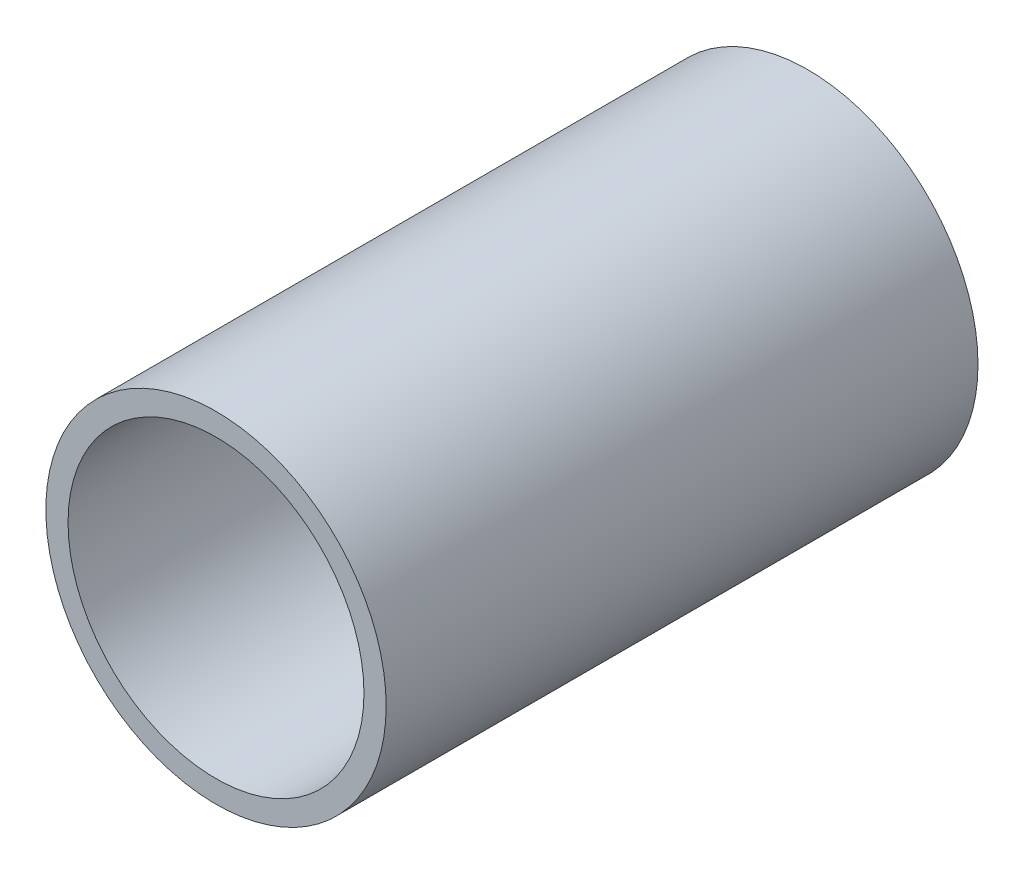
ISO-10303-21;
HEADER;
FILE_DESCRIPTION(('STEP AP214'),'2;1');
FILE_NAME('part.step','',(''),(''),'','','');
FILE_SCHEMA(('AUTOMOTIVE_DESIGN { 1 0 10303 214 1 1 1 1 }'));
ENDSEC;
DATA;
#1=APPLICATION_CONTEXT('core data for automotive mechanical design processes');
#2=APPLICATION_PROTOCOL_DEFINITION('international standard','automotive_design',2000,#1);
#3=PRODUCT_CONTEXT('',#1,'mechanical');
#4=PRODUCT('Part','Part','',(#3));
#5=PRODUCT_RELATED_PRODUCT_CATEGORY('part','',(#4));
#6=PRODUCT_DEFINITION_FORMATION('','',#4);
#7=PRODUCT_DEFINITION_CONTEXT('part definition',#1,'design');
#8=PRODUCT_DEFINITION('design','',#6,#7);
#9=PRODUCT_DEFINITION_SHAPE('','',#8);
#10=(LENGTH_UNIT() NAMED_UNIT(*) SI_UNIT(.MILLI.,.METRE.));
#11=(NAMED_UNIT(*) PLANE_ANGLE_UNIT() SI_UNIT($,.RADIAN.));
#12=(NAMED_UNIT(*) SI_UNIT($,.STERADIAN.) SOLID_ANGLE_UNIT());
#13=UNCERTAINTY_MEASURE_WITH_UNIT(LENGTH_MEASURE(1.E-05),#10,'distance_accuracy_value','');
#14=(GEOMETRIC_REPRESENTATION_CONTEXT(3) GLOBAL_UNCERTAINTY_ASSIGNED_CONTEXT((#13)) GLOBAL_UNIT_ASSIGNED_CONTEXT((#10,
#11,#12)) REPRESENTATION_CONTEXT('',''));
#15=CARTESIAN_POINT('',(0.,0.,0.));
#16=DIRECTION('',(0.,0.,1.));
#17=DIRECTION('',(1.,0.,0.));
#18=AXIS2_PLACEMENT_3D('',#15,#16,#17);
#19=CARTESIAN_POINT('',(0.,0.,60.));
#20=DIRECTION('',(0.,0.,1.));
#21=DIRECTION('',(1.,0.,0.));
#22=AXIS2_PLACEMENT_3D('',#19,#20,#21);
#23=PLANE('',#22);
#24=CARTESIAN_POINT('',(0.,0.,60.));
#25=DIRECTION('',(0.,0.,1.));
#26=DIRECTION('',(1.,0.,0.));
#27=AXIS2_PLACEMENT_3D('',#24,#25,#26);
#28=CIRCLE('',#27,17.25);
#29=CARTESIAN_POINT('',(17.25,0.,60.));
#30=VERTEX_POINT('',#29);
#31=EDGE_CURVE('E10',#30,#30,#28,.T.);
#32=ORIENTED_EDGE('',*,*,#31,.T.);
#33=EDGE_LOOP('',(#32));
#34=FACE_BOUND('',#33,.T.);
#35=CARTESIAN_POINT('',(0.,0.,60.));
#36=DIRECTION('',(0.,0.,1.));
#37=DIRECTION('',(1.,0.,0.));
#38=AXIS2_PLACEMENT_3D('',#35,#36,#37);
#39=CIRCLE('',#38,15.);
#40=CARTESIAN_POINT('',(15.,0.,60.));
#41=VERTEX_POINT('',#40);
#42=EDGE_CURVE('E46',#41,#41,#39,.T.);
#43=ORIENTED_EDGE('',*,*,#42,.F.);
#44=EDGE_LOOP('',(#43));
#45=FACE_BOUND('',#44,.T.);
#46=ADVANCED_FACE('F35',(#34,#45),#23,.T.);
#47=CARTESIAN_POINT('',(0.,0.,0.));
#48=DIRECTION('',(0.,0.,1.));
#49=DIRECTION('',(1.,0.,0.));
#50=AXIS2_PLACEMENT_3D('',#47,#48,#49);
#51=PLANE('',#50);
#52=CARTESIAN_POINT('',(0.,0.,0.));
#53=DIRECTION('',(0.,0.,1.));
#54=DIRECTION('',(1.,0.,0.));
#55=AXIS2_PLACEMENT_3D('',#52,#53,#54);
#56=CIRCLE('',#55,17.25);
#57=CARTESIAN_POINT('',(17.25,0.,0.));
#58=VERTEX_POINT('',#57);
#59=EDGE_CURVE('E39',#58,#58,#56,.T.);
#60=ORIENTED_EDGE('',*,*,#59,.F.);
#61=EDGE_LOOP('',(#60));
#62=FACE_BOUND('',#61,.T.);
#63=CARTESIAN_POINT('',(0.,0.,0.));
#64=DIRECTION('',(0.,0.,1.));
#65=DIRECTION('',(1.,0.,0.));
#66=AXIS2_PLACEMENT_3D('',#63,#64,#65);
#67=CIRCLE('',#66,15.);
#68=CARTESIAN_POINT('',(15.,0.,0.));
#69=VERTEX_POINT('',#68);
#70=EDGE_CURVE('E48',#69,#69,#67,.T.);
#71=ORIENTED_EDGE('',*,*,#70,.T.);
#72=EDGE_LOOP('',(#71));
#73=FACE_BOUND('',#72,.T.);
#74=ADVANCED_FACE('F58',(#62,#73),#51,.F.);
#75=CARTESIAN_POINT('',(0.,0.,60.));
#76=DIRECTION('',(0.,0.,-1.));
#77=DIRECTION('',(-1.,0.,0.));
#78=AXIS2_PLACEMENT_3D('',#75,#76,#77);
#79=CYLINDRICAL_SURFACE('',#78,17.25);
#80=ORIENTED_EDGE('',*,*,#31,.F.);
#81=EDGE_LOOP('',(#80));
#82=FACE_BOUND('',#81,.T.);
#83=ORIENTED_EDGE('',*,*,#59,.T.);
#84=EDGE_LOOP('',(#83));
#85=FACE_BOUND('',#84,.T.);
#86=ADVANCED_FACE('F37',(#82,#85),#79,.T.);
#87=CARTESIAN_POINT('',(0.,0.,60.));
#88=DIRECTION('',(0.,0.,-1.));
#89=DIRECTION('',(-1.,0.,0.));
#90=AXIS2_PLACEMENT_3D('',#87,#88,#89);
#91=CYLINDRICAL_SURFACE('',#90,15.);
#92=ORIENTED_EDGE('',*,*,#42,.T.);
#93=EDGE_LOOP('',(#92));
#94=FACE_BOUND('',#93,.T.);
#95=ORIENTED_EDGE('',*,*,#70,.F.);
#96=EDGE_LOOP('',(#95));
#97=FACE_BOUND('',#96,.T.);
#98=ADVANCED_FACE('F54',(#94,#97),#91,.F.);
#99=CLOSED_SHELL('',(#46,#74,#86,#98));
#100=MANIFOLD_SOLID_BREP('B2',#99);
#101=ADVANCED_BREP_SHAPE_REPRESENTATION('',(#18,#100),#14);
#102=SHAPE_DEFINITION_REPRESENTATION(#9,#101);
ENDSEC;
END-ISO-10303-21;
